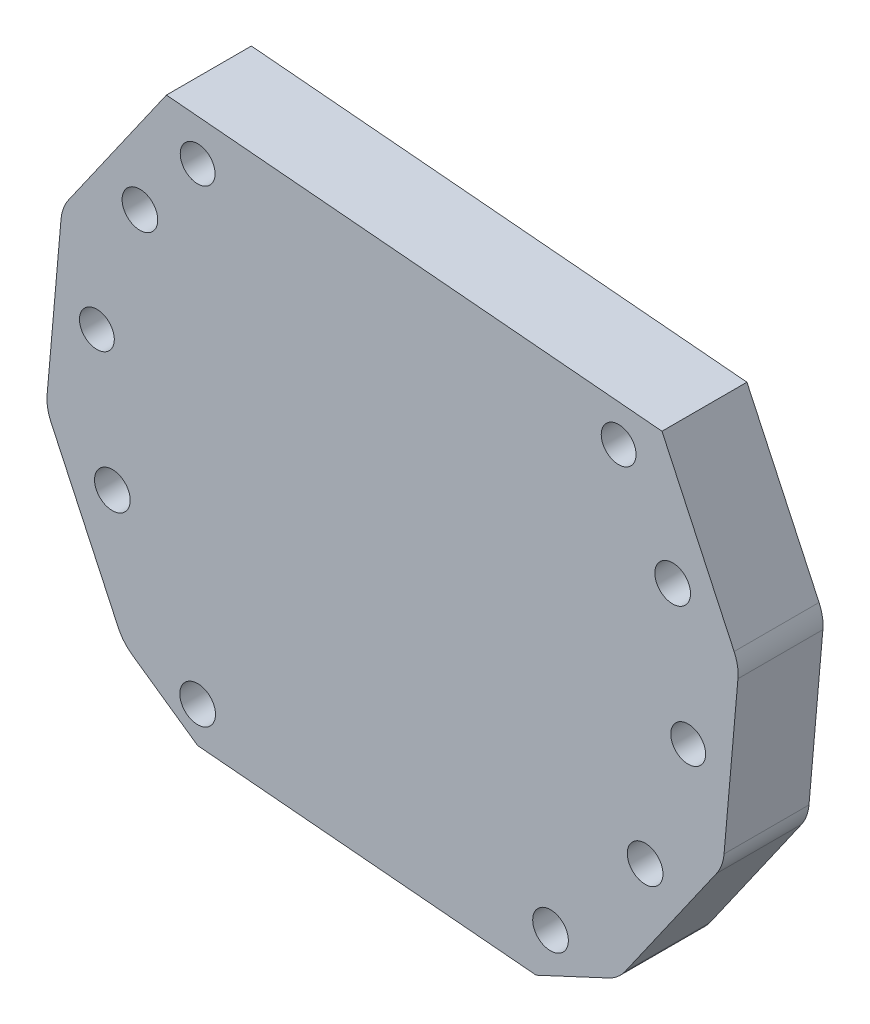
ISO-10303-21;
HEADER;
FILE_DESCRIPTION(('STEP AP214'),'2;1');
FILE_NAME('part.step','',(''),(''),'','','');
FILE_SCHEMA(('AUTOMOTIVE_DESIGN { 1 0 10303 214 1 1 1 1 }'));
ENDSEC;
DATA;
#1=APPLICATION_CONTEXT('core data for automotive mechanical design processes');
#2=APPLICATION_PROTOCOL_DEFINITION('international standard','automotive_design',2000,#1);
#3=PRODUCT_CONTEXT('',#1,'mechanical');
#4=PRODUCT('Part','Part','',(#3));
#5=PRODUCT_RELATED_PRODUCT_CATEGORY('part','',(#4));
#6=PRODUCT_DEFINITION_FORMATION('','',#4);
#7=PRODUCT_DEFINITION_CONTEXT('part definition',#1,'design');
#8=PRODUCT_DEFINITION('design','',#6,#7);
#9=PRODUCT_DEFINITION_SHAPE('','',#8);
#10=(LENGTH_UNIT() NAMED_UNIT(*) SI_UNIT(.MILLI.,.METRE.));
#11=(NAMED_UNIT(*) PLANE_ANGLE_UNIT() SI_UNIT($,.RADIAN.));
#12=(NAMED_UNIT(*) SI_UNIT($,.STERADIAN.) SOLID_ANGLE_UNIT());
#13=UNCERTAINTY_MEASURE_WITH_UNIT(LENGTH_MEASURE(1.E-05),#10,'distance_accuracy_value','');
#14=(GEOMETRIC_REPRESENTATION_CONTEXT(3) GLOBAL_UNCERTAINTY_ASSIGNED_CONTEXT((#13)) GLOBAL_UNIT_ASSIGNED_CONTEXT((#10,
#11,#12)) REPRESENTATION_CONTEXT('',''));
#15=CARTESIAN_POINT('',(0.,0.,0.));
#16=DIRECTION('',(0.,0.,1.));
#17=DIRECTION('',(1.,0.,0.));
#18=AXIS2_PLACEMENT_3D('',#15,#16,#17);
#19=CARTESIAN_POINT('',(-26.6185080548484,31.7227026038633,10.));
#20=DIRECTION('',(-0.087155742747654,-0.996194698091746,0.));
#21=DIRECTION('',(0.996194698091746,-0.087155742747654,0.));
#22=AXIS2_PLACEMENT_3D('',#19,#20,#21);
#23=PLANE('',#22);
#24=DIRECTION('',(-0.996194698091746,0.087155742747654,0.));
#25=VECTOR('',#24,1.);
#26=CARTESIAN_POINT('',(-26.6185080548484,31.7227026038633,0.));
#27=LINE('',#26,#25);
#28=CARTESIAN_POINT('',(31.7227026038633,26.6185080548484,0.));
#29=VERTEX_POINT('',#28);
#30=CARTESIAN_POINT('',(-26.6185080548484,31.7227026038633,0.));
#31=VERTEX_POINT('',#30);
#32=EDGE_CURVE('E172',#29,#31,#27,.T.);
#33=ORIENTED_EDGE('',*,*,#32,.T.);
#34=DIRECTION('',(0.,0.,-1.));
#35=VECTOR('',#34,1.);
#36=CARTESIAN_POINT('',(-26.6185080548484,31.7227026038633,10.));
#37=LINE('',#36,#35);
#38=CARTESIAN_POINT('',(-26.6185080548484,31.7227026038633,10.));
#39=VERTEX_POINT('',#38);
#40=EDGE_CURVE('E154',#39,#31,#37,.T.);
#41=ORIENTED_EDGE('',*,*,#40,.F.);
#42=DIRECTION('',(-0.996194698091746,0.087155742747654,0.));
#43=VECTOR('',#42,1.);
#44=CARTESIAN_POINT('',(-26.6185080548484,31.7227026038633,10.));
#45=LINE('',#44,#43);
#46=CARTESIAN_POINT('',(31.7227026038633,26.6185080548484,10.));
#47=VERTEX_POINT('',#46);
#48=EDGE_CURVE('E160',#47,#39,#45,.T.);
#49=ORIENTED_EDGE('',*,*,#48,.F.);
#50=DIRECTION('',(0.,0.,-1.));
#51=VECTOR('',#50,1.);
#52=CARTESIAN_POINT('',(31.7227026038633,26.6185080548484,10.));
#53=LINE('',#52,#51);
#54=EDGE_CURVE('E253',#47,#29,#53,.T.);
#55=ORIENTED_EDGE('',*,*,#54,.T.);
#56=EDGE_LOOP('',(#33,#41,#49,#55));
#57=FACE_BOUND('',#56,.T.);
#58=ADVANCED_FACE('F35',(#57),#23,.F.);
#59=CARTESIAN_POINT('',(-26.6185080548484,31.7227026038633,10.));
#60=DIRECTION('',(0.819152044288994,-0.573576436351043,0.));
#61=DIRECTION('',(0.573576436351043,0.819152044288994,0.));
#62=AXIS2_PLACEMENT_3D('',#59,#60,#61);
#63=PLANE('',#62);
#64=DIRECTION('',(-0.573576436351043,-0.819152044288994,0.));
#65=VECTOR('',#64,1.);
#66=CARTESIAN_POINT('',(-26.6185080548484,31.7227026038633,0.));
#67=LINE('',#66,#65);
#68=CARTESIAN_POINT('',(-38.1452087736822,15.2608679479478,0.));
#69=VERTEX_POINT('',#68);
#70=EDGE_CURVE('E274',#31,#69,#67,.T.);
#71=ORIENTED_EDGE('',*,*,#70,.T.);
#72=DIRECTION('',(0.,0.,-1.));
#73=VECTOR('',#72,1.);
#74=CARTESIAN_POINT('',(-38.1452087736822,15.2608679479478,10.));
#75=LINE('',#74,#73);
#76=CARTESIAN_POINT('',(-38.1452087736822,15.2608679479478,10.));
#77=VERTEX_POINT('',#76);
#78=EDGE_CURVE('E157',#69,#77,#75,.F.);
#79=ORIENTED_EDGE('',*,*,#78,.T.);
#80=DIRECTION('',(-0.573576436351043,-0.819152044288994,0.));
#81=VECTOR('',#80,1.);
#82=CARTESIAN_POINT('',(-26.6185080548484,31.7227026038633,10.));
#83=LINE('',#82,#81);
#84=EDGE_CURVE('E149',#39,#77,#83,.T.);
#85=ORIENTED_EDGE('',*,*,#84,.F.);
#86=ORIENTED_EDGE('',*,*,#40,.T.);
#87=EDGE_LOOP('',(#71,#79,#85,#86));
#88=FACE_BOUND('',#87,.T.);
#89=ADVANCED_FACE('F152',(#88),#63,.F.);
#90=CARTESIAN_POINT('',(-38.9136554882711,14.1634123042201,10.));
#91=DIRECTION('',(0.996194698091746,-0.0871557427476537,0.));
#92=DIRECTION('',(0.0871557427476537,0.996194698091746,0.));
#93=AXIS2_PLACEMENT_3D('',#90,#91,#92);
#94=PLANE('',#93);
#95=DIRECTION('',(-0.0871557427476537,-0.996194698091746,0.));
#96=VECTOR('',#95,1.);
#97=CARTESIAN_POINT('',(-38.9136554882711,14.1634123042201,0.));
#98=LINE('',#97,#96);
#99=CARTESIAN_POINT('',(-39.0304220426959,12.8287644799309,0.));
#100=VERTEX_POINT('',#99);
#101=CARTESIAN_POINT('',(-40.6651538046437,-5.85630506011857,0.));
#102=VERTEX_POINT('',#101);
#103=EDGE_CURVE('E271',#100,#102,#98,.T.);
#104=ORIENTED_EDGE('',*,*,#103,.T.);
#105=DIRECTION('',(0.,0.,-1.));
#106=VECTOR('',#105,1.);
#107=CARTESIAN_POINT('',(-40.6651538046437,-5.85630506011857,10.));
#108=LINE('',#107,#106);
#109=CARTESIAN_POINT('',(-40.6651538046437,-5.85630506011857,10.));
#110=VERTEX_POINT('',#109);
#111=EDGE_CURVE('E214',#102,#110,#108,.F.);
#112=ORIENTED_EDGE('',*,*,#111,.T.);
#113=DIRECTION('',(-0.0871557427476537,-0.996194698091746,0.));
#114=VECTOR('',#113,1.);
#115=CARTESIAN_POINT('',(-38.9136554882711,14.1634123042201,10.));
#116=LINE('',#115,#114);
#117=CARTESIAN_POINT('',(-39.0304220426959,12.8287644799309,10.));
#118=VERTEX_POINT('',#117);
#119=EDGE_CURVE('E159',#118,#110,#116,.T.);
#120=ORIENTED_EDGE('',*,*,#119,.F.);
#121=DIRECTION('',(0.,0.,-1.));
#122=VECTOR('',#121,1.);
#123=CARTESIAN_POINT('',(-39.0304220426959,12.8287644799309,10.));
#124=LINE('',#123,#122);
#125=EDGE_CURVE('E211',#118,#100,#124,.T.);
#126=ORIENTED_EDGE('',*,*,#125,.T.);
#127=EDGE_LOOP('',(#104,#112,#120,#126));
#128=FACE_BOUND('',#127,.T.);
#129=ADVANCED_FACE('F382',(#128),#94,.F.);
#130=CARTESIAN_POINT('',(-40.7819203590686,-7.19095288440781,10.));
#131=DIRECTION('',(0.906307787036648,0.422618261740704,0.));
#132=DIRECTION('',(-0.422618261740704,0.906307787036648,0.));
#133=AXIS2_PLACEMENT_3D('',#130,#131,#132);
#134=PLANE('',#133);
#135=DIRECTION('',(0.422618261740704,-0.906307787036648,0.));
#136=VECTOR('',#135,1.);
#137=CARTESIAN_POINT('',(-40.7819203590686,-7.19095288440781,0.));
#138=LINE('',#137,#136);
#139=CARTESIAN_POINT('',(-40.2157192493682,-8.40517508256035,0.));
#140=VERTEX_POINT('',#139);
#141=CARTESIAN_POINT('',(-32.2889037135636,-25.4042858566959,0.));
#142=VERTEX_POINT('',#141);
#143=EDGE_CURVE('E266',#140,#142,#138,.T.);
#144=ORIENTED_EDGE('',*,*,#143,.T.);
#145=DIRECTION('',(0.,0.,-1.));
#146=VECTOR('',#145,1.);
#147=CARTESIAN_POINT('',(-32.2889037135636,-25.4042858566959,10.));
#148=LINE('',#147,#146);
#149=CARTESIAN_POINT('',(-32.2889037135636,-25.4042858566959,10.));
#150=VERTEX_POINT('',#149);
#151=EDGE_CURVE('E198',#142,#150,#148,.F.);
#152=ORIENTED_EDGE('',*,*,#151,.T.);
#153=DIRECTION('',(0.422618261740704,-0.906307787036648,0.));
#154=VECTOR('',#153,1.);
#155=CARTESIAN_POINT('',(-40.7819203590686,-7.19095288440781,10.));
#156=LINE('',#155,#154);
#157=CARTESIAN_POINT('',(-40.2157192493682,-8.40517508256035,10.));
#158=VERTEX_POINT('',#157);
#159=EDGE_CURVE('E287',#158,#150,#156,.T.);
#160=ORIENTED_EDGE('',*,*,#159,.F.);
#161=DIRECTION('',(0.,0.,-1.));
#162=VECTOR('',#161,1.);
#163=CARTESIAN_POINT('',(-40.2157192493682,-8.40517508256035,10.));
#164=LINE('',#163,#162);
#165=EDGE_CURVE('E195',#158,#140,#164,.T.);
#166=ORIENTED_EDGE('',*,*,#165,.T.);
#167=EDGE_LOOP('',(#144,#152,#160,#166));
#168=FACE_BOUND('',#167,.T.);
#169=ADVANCED_FACE('F419',(#168),#134,.F.);
#170=CARTESIAN_POINT('',(-31.7227026038632,-26.6185080548485,10.));
#171=DIRECTION('',(0.573576436351043,0.819152044288994,0.));
#172=DIRECTION('',(-0.819152044288994,0.573576436351043,0.));
#173=AXIS2_PLACEMENT_3D('',#170,#171,#172);
#174=PLANE('',#173);
#175=DIRECTION('',(0.819152044288994,-0.573576436351043,0.));
#176=VECTOR('',#175,1.);
#177=CARTESIAN_POINT('',(-31.7227026038632,-26.6185080548485,10.));
#178=LINE('',#177,#176);
#179=CARTESIAN_POINT('',(-30.6252469601355,-27.3869547694374,10.));
#180=VERTEX_POINT('',#179);
#181=CARTESIAN_POINT('',(-22.9430574540417,-32.7660817715598,10.));
#182=VERTEX_POINT('',#181);
#183=EDGE_CURVE('E285',#180,#182,#178,.T.);
#184=ORIENTED_EDGE('',*,*,#183,.F.);
#185=DIRECTION('',(0.,0.,-1.));
#186=VECTOR('',#185,1.);
#187=CARTESIAN_POINT('',(-30.6252469601355,-27.3869547694374,10.));
#188=LINE('',#187,#186);
#189=CARTESIAN_POINT('',(-30.6252469601355,-27.3869547694374,0.));
#190=VERTEX_POINT('',#189);
#191=EDGE_CURVE('E173',#180,#190,#188,.T.);
#192=ORIENTED_EDGE('',*,*,#191,.T.);
#193=DIRECTION('',(0.819152044288994,-0.573576436351043,0.));
#194=VECTOR('',#193,1.);
#195=CARTESIAN_POINT('',(-31.7227026038632,-26.6185080548485,0.));
#196=LINE('',#195,#194);
#197=CARTESIAN_POINT('',(-22.9430574540417,-32.7660817715598,0.));
#198=VERTEX_POINT('',#197);
#199=EDGE_CURVE('E265',#190,#198,#196,.T.);
#200=ORIENTED_EDGE('',*,*,#199,.T.);
#201=DIRECTION('',(0.,0.,-1.));
#202=VECTOR('',#201,1.);
#203=CARTESIAN_POINT('',(-22.9430574540417,-32.7660817715598,10.));
#204=LINE('',#203,#202);
#205=EDGE_CURVE('E174',#182,#198,#204,.T.);
#206=ORIENTED_EDGE('',*,*,#205,.F.);
#207=EDGE_LOOP('',(#184,#192,#200,#206));
#208=FACE_BOUND('',#207,.T.);
#209=ADVANCED_FACE('F413',(#208),#174,.F.);
#210=CARTESIAN_POINT('',(16.9047304696281,-36.2523114814659,10.));
#211=DIRECTION('',(0.0871557427476537,0.996194698091746,0.));
#212=DIRECTION('',(-0.996194698091746,0.0871557427476537,0.));
#213=AXIS2_PLACEMENT_3D('',#210,#211,#212);
#214=PLANE('',#213);
#215=DIRECTION('',(0.996194698091746,-0.0871557427476537,0.));
#216=VECTOR('',#215,1.);
#217=CARTESIAN_POINT('',(16.9047304696281,-36.2523114814659,0.));
#218=LINE('',#217,#216);
#219=CARTESIAN_POINT('',(16.9047304696281,-36.2523114814659,0.));
#220=VERTEX_POINT('',#219);
#221=EDGE_CURVE('E248',#198,#220,#218,.T.);
#222=ORIENTED_EDGE('',*,*,#221,.T.);
#223=DIRECTION('',(0.,0.,-1.));
#224=VECTOR('',#223,1.);
#225=CARTESIAN_POINT('',(16.9047304696281,-36.2523114814659,10.));
#226=LINE('',#225,#224);
#227=CARTESIAN_POINT('',(16.9047304696281,-36.2523114814659,10.));
#228=VERTEX_POINT('',#227);
#229=EDGE_CURVE('E180',#228,#220,#226,.T.);
#230=ORIENTED_EDGE('',*,*,#229,.F.);
#231=DIRECTION('',(0.996194698091746,-0.0871557427476537,0.));
#232=VECTOR('',#231,1.);
#233=CARTESIAN_POINT('',(16.9047304696281,-36.2523114814659,10.));
#234=LINE('',#233,#232);
#235=EDGE_CURVE('E283',#182,#228,#234,.T.);
#236=ORIENTED_EDGE('',*,*,#235,.F.);
#237=ORIENTED_EDGE('',*,*,#205,.T.);
#238=EDGE_LOOP('',(#222,#230,#236,#237));
#239=FACE_BOUND('',#238,.T.);
#240=ADVANCED_FACE('F411',(#239),#214,.F.);
#241=CARTESIAN_POINT('',(16.9047304696281,-36.2523114814659,10.));
#242=DIRECTION('',(-0.422618261740703,0.906307787036648,0.));
#243=DIRECTION('',(-0.906307787036648,-0.422618261740703,0.));
#244=AXIS2_PLACEMENT_3D('',#241,#242,#243);
#245=PLANE('',#244);
#246=DIRECTION('',(0.906307787036648,0.422618261740703,0.));
#247=VECTOR('',#246,1.);
#248=CARTESIAN_POINT('',(16.9047304696281,-36.2523114814659,0.));
#249=LINE('',#248,#247);
#250=CARTESIAN_POINT('',(25.4042858566959,-32.2889037135636,0.));
#251=VERTEX_POINT('',#250);
#252=EDGE_CURVE('E245',#220,#251,#249,.T.);
#253=ORIENTED_EDGE('',*,*,#252,.T.);
#254=DIRECTION('',(0.,0.,-1.));
#255=VECTOR('',#254,1.);
#256=CARTESIAN_POINT('',(25.4042858566959,-32.2889037135636,10.));
#257=LINE('',#256,#255);
#258=CARTESIAN_POINT('',(25.4042858566959,-32.2889037135636,10.));
#259=VERTEX_POINT('',#258);
#260=EDGE_CURVE('E11',#251,#259,#257,.F.);
#261=ORIENTED_EDGE('',*,*,#260,.T.);
#262=DIRECTION('',(0.906307787036648,0.422618261740703,0.));
#263=VECTOR('',#262,1.);
#264=CARTESIAN_POINT('',(16.9047304696281,-36.2523114814659,10.));
#265=LINE('',#264,#263);
#266=EDGE_CURVE('E261',#228,#259,#265,.T.);
#267=ORIENTED_EDGE('',*,*,#266,.F.);
#268=ORIENTED_EDGE('',*,*,#229,.T.);
#269=EDGE_LOOP('',(#253,#261,#267,#268));
#270=FACE_BOUND('',#269,.T.);
#271=ADVANCED_FACE('F258',(#270),#245,.F.);
#272=CARTESIAN_POINT('',(26.6185080548484,-31.7227026038633,10.));
#273=DIRECTION('',(-0.819152044288994,0.573576436351043,0.));
#274=DIRECTION('',(-0.573576436351043,-0.819152044288994,0.));
#275=AXIS2_PLACEMENT_3D('',#272,#273,#274);
#276=PLANE('',#275);
#277=DIRECTION('',(0.573576436351043,0.819152044288994,0.));
#278=VECTOR('',#277,1.);
#279=CARTESIAN_POINT('',(26.6185080548484,-31.7227026038633,10.));
#280=LINE('',#279,#278);
#281=CARTESIAN_POINT('',(27.3869547694374,-30.6252469601356,10.));
#282=VERTEX_POINT('',#281);
#283=CARTESIAN_POINT('',(38.1452087736822,-15.2608679479478,10.));
#284=VERTEX_POINT('',#283);
#285=EDGE_CURVE('E235',#282,#284,#280,.T.);
#286=ORIENTED_EDGE('',*,*,#285,.F.);
#287=DIRECTION('',(0.,0.,-1.));
#288=VECTOR('',#287,1.);
#289=CARTESIAN_POINT('',(27.3869547694374,-30.6252469601356,10.));
#290=LINE('',#289,#288);
#291=CARTESIAN_POINT('',(27.3869547694374,-30.6252469601356,0.));
#292=VERTEX_POINT('',#291);
#293=EDGE_CURVE('E43',#282,#292,#290,.T.);
#294=ORIENTED_EDGE('',*,*,#293,.T.);
#295=DIRECTION('',(0.573576436351043,0.819152044288994,0.));
#296=VECTOR('',#295,1.);
#297=CARTESIAN_POINT('',(26.6185080548484,-31.7227026038633,0.));
#298=LINE('',#297,#296);
#299=CARTESIAN_POINT('',(38.1452087736822,-15.2608679479478,0.));
#300=VERTEX_POINT('',#299);
#301=EDGE_CURVE('E232',#292,#300,#298,.T.);
#302=ORIENTED_EDGE('',*,*,#301,.T.);
#303=DIRECTION('',(0.,0.,-1.));
#304=VECTOR('',#303,1.);
#305=CARTESIAN_POINT('',(38.1452087736822,-15.2608679479478,10.));
#306=LINE('',#305,#304);
#307=EDGE_CURVE('E224',#300,#284,#306,.F.);
#308=ORIENTED_EDGE('',*,*,#307,.T.);
#309=EDGE_LOOP('',(#286,#294,#302,#308));
#310=FACE_BOUND('',#309,.T.);
#311=ADVANCED_FACE('F231',(#310),#276,.F.);
#312=CARTESIAN_POINT('',(38.9136554882711,-14.1634123042201,10.));
#313=DIRECTION('',(-0.996194698091746,0.0871557427476546,0.));
#314=DIRECTION('',(-0.0871557427476546,-0.996194698091746,0.));
#315=AXIS2_PLACEMENT_3D('',#312,#313,#314);
#316=PLANE('',#315);
#317=DIRECTION('',(0.0871557427476546,0.996194698091746,0.));
#318=VECTOR('',#317,1.);
#319=CARTESIAN_POINT('',(38.9136554882711,-14.1634123042201,0.));
#320=LINE('',#319,#318);
#321=CARTESIAN_POINT('',(39.0304220426959,-12.8287644799309,0.));
#322=VERTEX_POINT('',#321);
#323=CARTESIAN_POINT('',(40.6651538046438,5.85630506011856,0.));
#324=VERTEX_POINT('',#323);
#325=EDGE_CURVE('E244',#322,#324,#320,.T.);
#326=ORIENTED_EDGE('',*,*,#325,.T.);
#327=DIRECTION('',(0.,0.,-1.));
#328=VECTOR('',#327,1.);
#329=CARTESIAN_POINT('',(40.6651538046438,5.85630506011856,10.));
#330=LINE('',#329,#328);
#331=CARTESIAN_POINT('',(40.6651538046438,5.85630506011856,10.));
#332=VERTEX_POINT('',#331);
#333=EDGE_CURVE('E58',#324,#332,#330,.F.);
#334=ORIENTED_EDGE('',*,*,#333,.T.);
#335=DIRECTION('',(0.0871557427476546,0.996194698091746,0.));
#336=VECTOR('',#335,1.);
#337=CARTESIAN_POINT('',(38.9136554882711,-14.1634123042201,10.));
#338=LINE('',#337,#336);
#339=CARTESIAN_POINT('',(39.0304220426959,-12.8287644799309,10.));
#340=VERTEX_POINT('',#339);
#341=EDGE_CURVE('E279',#340,#332,#338,.T.);
#342=ORIENTED_EDGE('',*,*,#341,.F.);
#343=DIRECTION('',(0.,0.,-1.));
#344=VECTOR('',#343,1.);
#345=CARTESIAN_POINT('',(39.0304220426959,-12.8287644799309,10.));
#346=LINE('',#345,#344);
#347=EDGE_CURVE('E220',#340,#322,#346,.T.);
#348=ORIENTED_EDGE('',*,*,#347,.T.);
#349=EDGE_LOOP('',(#326,#334,#342,#348));
#350=FACE_BOUND('',#349,.T.);
#351=ADVANCED_FACE('F433',(#350),#316,.F.);
#352=CARTESIAN_POINT('',(40.7819203590686,7.19095288440781,10.));
#353=DIRECTION('',(-0.906307787036648,-0.422618261740703,0.));
#354=DIRECTION('',(0.422618261740703,-0.906307787036648,0.));
#355=AXIS2_PLACEMENT_3D('',#352,#353,#354);
#356=PLANE('',#355);
#357=DIRECTION('',(-0.422618261740703,0.906307787036648,0.));
#358=VECTOR('',#357,1.);
#359=CARTESIAN_POINT('',(40.7819203590686,7.19095288440781,10.));
#360=LINE('',#359,#358);
#361=CARTESIAN_POINT('',(40.2157192493683,8.40517508256034,10.));
#362=VERTEX_POINT('',#361);
#363=EDGE_CURVE('E165',#362,#47,#360,.T.);
#364=ORIENTED_EDGE('',*,*,#363,.F.);
#365=DIRECTION('',(0.,0.,-1.));
#366=VECTOR('',#365,1.);
#367=CARTESIAN_POINT('',(40.2157192493683,8.40517508256034,10.));
#368=LINE('',#367,#366);
#369=CARTESIAN_POINT('',(40.2157192493683,8.40517508256034,0.));
#370=VERTEX_POINT('',#369);
#371=EDGE_CURVE('E217',#362,#370,#368,.T.);
#372=ORIENTED_EDGE('',*,*,#371,.T.);
#373=DIRECTION('',(-0.422618261740703,0.906307787036648,0.));
#374=VECTOR('',#373,1.);
#375=CARTESIAN_POINT('',(40.7819203590686,7.19095288440781,0.));
#376=LINE('',#375,#374);
#377=EDGE_CURVE('E169',#370,#29,#376,.T.);
#378=ORIENTED_EDGE('',*,*,#377,.T.);
#379=ORIENTED_EDGE('',*,*,#54,.F.);
#380=EDGE_LOOP('',(#364,#372,#378,#379));
#381=FACE_BOUND('',#380,.T.);
#382=ADVANCED_FACE('F430',(#381),#356,.F.);
#383=CARTESIAN_POINT('',(0.,0.,10.));
#384=DIRECTION('',(0.,0.,1.));
#385=DIRECTION('',(1.,0.,0.));
#386=AXIS2_PLACEMENT_3D('',#383,#384,#385);
#387=PLANE('',#386);
#388=CARTESIAN_POINT('',(34.8066543870985,-3.73808346977133,10.));
#389=DIRECTION('',(0.,0.,-1.));
#390=DIRECTION('',(-1.,0.,0.));
#391=AXIS2_PLACEMENT_3D('',#388,#389,#390);
#392=CIRCLE('',#391,2.04999999999999);
#393=CARTESIAN_POINT('',(32.7566543870985,-3.73808346977133,10.));
#394=VERTEX_POINT('',#393);
#395=EDGE_CURVE('E324',#394,#394,#392,.T.);
#396=ORIENTED_EDGE('',*,*,#395,.T.);
#397=EDGE_LOOP('',(#396));
#398=FACE_BOUND('',#397,.T.);
#399=CARTESIAN_POINT('',(29.737818365617,-18.4699381835315,10.));
#400=DIRECTION('',(0.,0.,-1.));
#401=DIRECTION('',(-1.,0.,0.));
#402=AXIS2_PLACEMENT_3D('',#399,#400,#401);
#403=CIRCLE('',#402,2.10000000000001);
#404=CARTESIAN_POINT('',(27.637818365617,-18.4699381835315,10.));
#405=VERTEX_POINT('',#404);
#406=EDGE_CURVE('E331',#405,#405,#403,.T.);
#407=ORIENTED_EDGE('',*,*,#406,.T.);
#408=EDGE_LOOP('',(#407));
#409=FACE_BOUND('',#408,.T.);
#410=CARTESIAN_POINT('',(18.6012536594375,-30.8220325763131,10.));
#411=DIRECTION('',(0.,0.,-1.));
#412=DIRECTION('',(-1.,0.,0.));
#413=AXIS2_PLACEMENT_3D('',#410,#411,#412);
#414=CIRCLE('',#413,2.1);
#415=CARTESIAN_POINT('',(16.5012536594375,-30.8220325763131,10.));
#416=VERTEX_POINT('',#415);
#417=EDGE_CURVE('E337',#416,#416,#414,.T.);
#418=ORIENTED_EDGE('',*,*,#417,.T.);
#419=EDGE_LOOP('',(#418));
#420=FACE_BOUND('',#419,.T.);
#421=CARTESIAN_POINT('',(-22.9430574540417,-28.5378329384699,10.));
#422=DIRECTION('',(0.,0.,-1.));
#423=DIRECTION('',(-1.,0.,0.));
#424=AXIS2_PLACEMENT_3D('',#421,#422,#423);
#425=CIRCLE('',#424,2.1);
#426=CARTESIAN_POINT('',(-25.0430574540417,-28.5378329384699,10.));
#427=VERTEX_POINT('',#426);
#428=EDGE_CURVE('E301',#427,#427,#425,.T.);
#429=ORIENTED_EDGE('',*,*,#428,.T.);
#430=EDGE_LOOP('',(#429));
#431=FACE_BOUND('',#430,.T.);
#432=CARTESIAN_POINT('',(-32.9816056316129,-11.734144519762,10.));
#433=DIRECTION('',(0.,0.,-1.));
#434=DIRECTION('',(-1.,0.,0.));
#435=AXIS2_PLACEMENT_3D('',#432,#433,#434);
#436=CIRCLE('',#435,2.1);
#437=CARTESIAN_POINT('',(-35.0816056316129,-11.734144519762,10.));
#438=VERTEX_POINT('',#437);
#439=EDGE_CURVE('E300',#438,#438,#436,.T.);
#440=ORIENTED_EDGE('',*,*,#439,.T.);
#441=EDGE_LOOP('',(#440));
#442=FACE_BOUND('',#441,.T.);
#443=CARTESIAN_POINT('',(-34.8066543870985,3.73808346977158,10.));
#444=DIRECTION('',(0.,0.,-1.));
#445=DIRECTION('',(-1.,0.,0.));
#446=AXIS2_PLACEMENT_3D('',#443,#444,#445);
#447=CIRCLE('',#446,2.04999999999999);
#448=CARTESIAN_POINT('',(-36.8566543870985,3.73808346977158,10.));
#449=VERTEX_POINT('',#448);
#450=EDGE_CURVE('E307',#449,#449,#447,.T.);
#451=ORIENTED_EDGE('',*,*,#450,.T.);
#452=EDGE_LOOP('',(#451));
#453=FACE_BOUND('',#452,.T.);
#454=CARTESIAN_POINT('',(-29.7378183656169,18.4699381835317,10.));
#455=DIRECTION('',(0.,0.,-1.));
#456=DIRECTION('',(-1.,0.,0.));
#457=AXIS2_PLACEMENT_3D('',#454,#455,#456);
#458=CIRCLE('',#457,2.1);
#459=CARTESIAN_POINT('',(-31.8378183656169,18.4699381835317,10.));
#460=VERTEX_POINT('',#459);
#461=EDGE_CURVE('E313',#460,#460,#458,.T.);
#462=ORIENTED_EDGE('',*,*,#461,.T.);
#463=EDGE_LOOP('',(#462));
#464=FACE_BOUND('',#463,.T.);
#465=CARTESIAN_POINT('',(-22.9430574540417,26.5542753286264,10.));
#466=DIRECTION('',(0.,0.,-1.));
#467=DIRECTION('',(-1.,0.,0.));
#468=AXIS2_PLACEMENT_3D('',#465,#466,#467);
#469=CIRCLE('',#468,2.05);
#470=CARTESIAN_POINT('',(-24.9930574540417,26.5542753286264,10.));
#471=VERTEX_POINT('',#470);
#472=EDGE_CURVE('E294',#471,#471,#469,.T.);
#473=ORIENTED_EDGE('',*,*,#472,.T.);
#474=EDGE_LOOP('',(#473));
#475=FACE_BOUND('',#474,.T.);
#476=CARTESIAN_POINT('',(32.981605631613,11.7341445197618,10.));
#477=DIRECTION('',(0.,0.,-1.));
#478=DIRECTION('',(-1.,0.,0.));
#479=AXIS2_PLACEMENT_3D('',#476,#477,#478);
#480=CIRCLE('',#479,2.1);
#481=CARTESIAN_POINT('',(30.881605631613,11.7341445197618,10.));
#482=VERTEX_POINT('',#481);
#483=EDGE_CURVE('E325',#482,#482,#480,.T.);
#484=ORIENTED_EDGE('',*,*,#483,.T.);
#485=EDGE_LOOP('',(#484));
#486=FACE_BOUND('',#485,.T.);
#487=CARTESIAN_POINT('',(26.6185080548484,22.7058718934025,10.));
#488=DIRECTION('',(0.,0.,-1.));
#489=DIRECTION('',(-1.,0.,0.));
#490=AXIS2_PLACEMENT_3D('',#487,#488,#489);
#491=CIRCLE('',#490,2.05);
#492=CARTESIAN_POINT('',(24.5685080548484,22.7058718934025,10.));
#493=VERTEX_POINT('',#492);
#494=EDGE_CURVE('E277',#493,#493,#491,.T.);
#495=ORIENTED_EDGE('',*,*,#494,.T.);
#496=EDGE_LOOP('',(#495));
#497=FACE_BOUND('',#496,.T.);
#498=ORIENTED_EDGE('',*,*,#159,.T.);
#499=CARTESIAN_POINT('',(-27.7573647783803,-23.2911945479924,10.));
#500=DIRECTION('',(0.,0.,1.));
#501=DIRECTION('',(1.,0.,0.));
#502=AXIS2_PLACEMENT_3D('',#499,#500,#501);
#503=CIRCLE('',#502,5.);
#504=EDGE_CURVE('E209',#150,#180,#503,.T.);
#505=ORIENTED_EDGE('',*,*,#504,.T.);
#506=ORIENTED_EDGE('',*,*,#183,.T.);
#507=ORIENTED_EDGE('',*,*,#235,.T.);
#508=ORIENTED_EDGE('',*,*,#266,.T.);
#509=CARTESIAN_POINT('',(23.2911945479924,-27.7573647783804,10.));
#510=DIRECTION('',(0.,0.,1.));
#511=DIRECTION('',(1.,0.,0.));
#512=AXIS2_PLACEMENT_3D('',#509,#510,#511);
#513=CIRCLE('',#512,5.);
#514=EDGE_CURVE('E202',#259,#282,#513,.T.);
#515=ORIENTED_EDGE('',*,*,#514,.T.);
#516=ORIENTED_EDGE('',*,*,#285,.T.);
#517=CARTESIAN_POINT('',(34.0494485522372,-12.3929857661926,10.));
#518=DIRECTION('',(0.,0.,1.));
#519=DIRECTION('',(1.,0.,0.));
#520=AXIS2_PLACEMENT_3D('',#517,#518,#519);
#521=CIRCLE('',#520,5.);
#522=EDGE_CURVE('E200',#284,#340,#521,.T.);
#523=ORIENTED_EDGE('',*,*,#522,.T.);
#524=ORIENTED_EDGE('',*,*,#341,.T.);
#525=CARTESIAN_POINT('',(35.684180314185,6.29208377385683,10.));
#526=DIRECTION('',(0.,0.,1.));
#527=DIRECTION('',(1.,0.,0.));
#528=AXIS2_PLACEMENT_3D('',#525,#526,#527);
#529=CIRCLE('',#528,5.);
#530=EDGE_CURVE('E50',#332,#362,#529,.T.);
#531=ORIENTED_EDGE('',*,*,#530,.T.);
#532=ORIENTED_EDGE('',*,*,#363,.T.);
#533=ORIENTED_EDGE('',*,*,#48,.T.);
#534=ORIENTED_EDGE('',*,*,#84,.T.);
#535=CARTESIAN_POINT('',(-34.0494485522372,12.3929857661926,10.));
#536=DIRECTION('',(0.,0.,1.));
#537=DIRECTION('',(1.,0.,0.));
#538=AXIS2_PLACEMENT_3D('',#535,#536,#537);
#539=CIRCLE('',#538,5.);
#540=EDGE_CURVE('E205',#77,#118,#539,.T.);
#541=ORIENTED_EDGE('',*,*,#540,.T.);
#542=ORIENTED_EDGE('',*,*,#119,.T.);
#543=CARTESIAN_POINT('',(-35.684180314185,-6.29208377385683,10.));
#544=DIRECTION('',(0.,0.,1.));
#545=DIRECTION('',(1.,0.,0.));
#546=AXIS2_PLACEMENT_3D('',#543,#544,#545);
#547=CIRCLE('',#546,5.);
#548=EDGE_CURVE('E207',#110,#158,#547,.T.);
#549=ORIENTED_EDGE('',*,*,#548,.T.);
#550=EDGE_LOOP('',(#498,#505,#506,#507,#508,#515,#516,#523,#524,#531,#532,#533,#534,#541,#542,#549));
#551=FACE_BOUND('',#550,.T.);
#552=ADVANCED_FACE('F164',(#398,#409,#420,#431,#442,#453,#464,#475,#486,#497,#551),#387,.T.);
#553=CARTESIAN_POINT('',(0.,0.,0.));
#554=DIRECTION('',(0.,0.,1.));
#555=DIRECTION('',(1.,0.,0.));
#556=AXIS2_PLACEMENT_3D('',#553,#554,#555);
#557=PLANE('',#556);
#558=CARTESIAN_POINT('',(34.8066543870985,-3.73808346977133,0.));
#559=DIRECTION('',(0.,0.,-1.));
#560=DIRECTION('',(-1.,0.,0.));
#561=AXIS2_PLACEMENT_3D('',#558,#559,#560);
#562=CIRCLE('',#561,2.04999999999999);
#563=CARTESIAN_POINT('',(32.7566543870985,-3.73808346977133,0.));
#564=VERTEX_POINT('',#563);
#565=EDGE_CURVE('E321',#564,#564,#562,.T.);
#566=ORIENTED_EDGE('',*,*,#565,.F.);
#567=EDGE_LOOP('',(#566));
#568=FACE_BOUND('',#567,.T.);
#569=CARTESIAN_POINT('',(29.737818365617,-18.4699381835315,0.));
#570=DIRECTION('',(0.,0.,-1.));
#571=DIRECTION('',(-1.,0.,0.));
#572=AXIS2_PLACEMENT_3D('',#569,#570,#571);
#573=CIRCLE('',#572,2.10000000000001);
#574=CARTESIAN_POINT('',(27.637818365617,-18.4699381835315,0.));
#575=VERTEX_POINT('',#574);
#576=EDGE_CURVE('E328',#575,#575,#573,.T.);
#577=ORIENTED_EDGE('',*,*,#576,.F.);
#578=EDGE_LOOP('',(#577));
#579=FACE_BOUND('',#578,.T.);
#580=CARTESIAN_POINT('',(18.6012536594375,-30.8220325763131,0.));
#581=DIRECTION('',(0.,0.,-1.));
#582=DIRECTION('',(-1.,0.,0.));
#583=AXIS2_PLACEMENT_3D('',#580,#581,#582);
#584=CIRCLE('',#583,2.1);
#585=CARTESIAN_POINT('',(16.5012536594375,-30.8220325763131,0.));
#586=VERTEX_POINT('',#585);
#587=EDGE_CURVE('E334',#586,#586,#584,.T.);
#588=ORIENTED_EDGE('',*,*,#587,.F.);
#589=EDGE_LOOP('',(#588));
#590=FACE_BOUND('',#589,.T.);
#591=CARTESIAN_POINT('',(-22.9430574540417,-28.5378329384699,0.));
#592=DIRECTION('',(0.,0.,-1.));
#593=DIRECTION('',(-1.,0.,0.));
#594=AXIS2_PLACEMENT_3D('',#591,#592,#593);
#595=CIRCLE('',#594,2.1);
#596=CARTESIAN_POINT('',(-25.0430574540417,-28.5378329384699,0.));
#597=VERTEX_POINT('',#596);
#598=EDGE_CURVE('E340',#597,#597,#595,.T.);
#599=ORIENTED_EDGE('',*,*,#598,.F.);
#600=EDGE_LOOP('',(#599));
#601=FACE_BOUND('',#600,.T.);
#602=CARTESIAN_POINT('',(-32.9816056316129,-11.734144519762,0.));
#603=DIRECTION('',(0.,0.,-1.));
#604=DIRECTION('',(-1.,0.,0.));
#605=AXIS2_PLACEMENT_3D('',#602,#603,#604);
#606=CIRCLE('',#605,2.1);
#607=CARTESIAN_POINT('',(-35.0816056316129,-11.734144519762,0.));
#608=VERTEX_POINT('',#607);
#609=EDGE_CURVE('E297',#608,#608,#606,.T.);
#610=ORIENTED_EDGE('',*,*,#609,.F.);
#611=EDGE_LOOP('',(#610));
#612=FACE_BOUND('',#611,.T.);
#613=CARTESIAN_POINT('',(-34.8066543870985,3.73808346977158,0.));
#614=DIRECTION('',(0.,0.,-1.));
#615=DIRECTION('',(-1.,0.,0.));
#616=AXIS2_PLACEMENT_3D('',#613,#614,#615);
#617=CIRCLE('',#616,2.04999999999999);
#618=CARTESIAN_POINT('',(-36.8566543870985,3.73808346977158,0.));
#619=VERTEX_POINT('',#618);
#620=EDGE_CURVE('E304',#619,#619,#617,.T.);
#621=ORIENTED_EDGE('',*,*,#620,.F.);
#622=EDGE_LOOP('',(#621));
#623=FACE_BOUND('',#622,.T.);
#624=CARTESIAN_POINT('',(-29.7378183656169,18.4699381835317,0.));
#625=DIRECTION('',(0.,0.,-1.));
#626=DIRECTION('',(-1.,0.,0.));
#627=AXIS2_PLACEMENT_3D('',#624,#625,#626);
#628=CIRCLE('',#627,2.1);
#629=CARTESIAN_POINT('',(-31.8378183656169,18.4699381835317,0.));
#630=VERTEX_POINT('',#629);
#631=EDGE_CURVE('E310',#630,#630,#628,.T.);
#632=ORIENTED_EDGE('',*,*,#631,.F.);
#633=EDGE_LOOP('',(#632));
#634=FACE_BOUND('',#633,.T.);
#635=CARTESIAN_POINT('',(-22.9430574540417,26.5542753286264,0.));
#636=DIRECTION('',(0.,0.,-1.));
#637=DIRECTION('',(-1.,0.,0.));
#638=AXIS2_PLACEMENT_3D('',#635,#636,#637);
#639=CIRCLE('',#638,2.05);
#640=CARTESIAN_POINT('',(-24.9930574540417,26.5542753286264,0.));
#641=VERTEX_POINT('',#640);
#642=EDGE_CURVE('E316',#641,#641,#639,.T.);
#643=ORIENTED_EDGE('',*,*,#642,.F.);
#644=EDGE_LOOP('',(#643));
#645=FACE_BOUND('',#644,.T.);
#646=CARTESIAN_POINT('',(32.981605631613,11.7341445197618,0.));
#647=DIRECTION('',(0.,0.,-1.));
#648=DIRECTION('',(-1.,0.,0.));
#649=AXIS2_PLACEMENT_3D('',#646,#647,#648);
#650=CIRCLE('',#649,2.1);
#651=CARTESIAN_POINT('',(30.881605631613,11.7341445197618,0.));
#652=VERTEX_POINT('',#651);
#653=EDGE_CURVE('E345',#652,#652,#650,.T.);
#654=ORIENTED_EDGE('',*,*,#653,.F.);
#655=EDGE_LOOP('',(#654));
#656=FACE_BOUND('',#655,.T.);
#657=CARTESIAN_POINT('',(26.6185080548484,22.7058718934025,0.));
#658=DIRECTION('',(0.,0.,-1.));
#659=DIRECTION('',(-1.,0.,0.));
#660=AXIS2_PLACEMENT_3D('',#657,#658,#659);
#661=CIRCLE('',#660,2.05);
#662=CARTESIAN_POINT('',(24.5685080548484,22.7058718934025,0.));
#663=VERTEX_POINT('',#662);
#664=EDGE_CURVE('E291',#663,#663,#661,.T.);
#665=ORIENTED_EDGE('',*,*,#664,.F.);
#666=EDGE_LOOP('',(#665));
#667=FACE_BOUND('',#666,.T.);
#668=ORIENTED_EDGE('',*,*,#199,.F.);
#669=CARTESIAN_POINT('',(-27.7573647783803,-23.2911945479924,0.));
#670=DIRECTION('',(0.,0.,1.));
#671=DIRECTION('',(1.,0.,0.));
#672=AXIS2_PLACEMENT_3D('',#669,#670,#671);
#673=CIRCLE('',#672,5.);
#674=EDGE_CURVE('E193',#190,#142,#673,.F.);
#675=ORIENTED_EDGE('',*,*,#674,.T.);
#676=ORIENTED_EDGE('',*,*,#143,.F.);
#677=CARTESIAN_POINT('',(-35.684180314185,-6.29208377385683,0.));
#678=DIRECTION('',(0.,0.,1.));
#679=DIRECTION('',(1.,0.,0.));
#680=AXIS2_PLACEMENT_3D('',#677,#678,#679);
#681=CIRCLE('',#680,5.);
#682=EDGE_CURVE('E191',#140,#102,#681,.F.);
#683=ORIENTED_EDGE('',*,*,#682,.T.);
#684=ORIENTED_EDGE('',*,*,#103,.F.);
#685=CARTESIAN_POINT('',(-34.0494485522372,12.3929857661926,0.));
#686=DIRECTION('',(0.,0.,1.));
#687=DIRECTION('',(1.,0.,0.));
#688=AXIS2_PLACEMENT_3D('',#685,#686,#687);
#689=CIRCLE('',#688,5.);
#690=EDGE_CURVE('E189',#100,#69,#689,.F.);
#691=ORIENTED_EDGE('',*,*,#690,.T.);
#692=ORIENTED_EDGE('',*,*,#70,.F.);
#693=ORIENTED_EDGE('',*,*,#32,.F.);
#694=ORIENTED_EDGE('',*,*,#377,.F.);
#695=CARTESIAN_POINT('',(35.684180314185,6.29208377385683,0.));
#696=DIRECTION('',(0.,0.,1.));
#697=DIRECTION('',(1.,0.,0.));
#698=AXIS2_PLACEMENT_3D('',#695,#696,#697);
#699=CIRCLE('',#698,5.);
#700=EDGE_CURVE('E187',#370,#324,#699,.F.);
#701=ORIENTED_EDGE('',*,*,#700,.T.);
#702=ORIENTED_EDGE('',*,*,#325,.F.);
#703=CARTESIAN_POINT('',(34.0494485522372,-12.3929857661926,0.));
#704=DIRECTION('',(0.,0.,1.));
#705=DIRECTION('',(1.,0.,0.));
#706=AXIS2_PLACEMENT_3D('',#703,#704,#705);
#707=CIRCLE('',#706,5.);
#708=EDGE_CURVE('E177',#322,#300,#707,.F.);
#709=ORIENTED_EDGE('',*,*,#708,.T.);
#710=ORIENTED_EDGE('',*,*,#301,.F.);
#711=CARTESIAN_POINT('',(23.2911945479924,-27.7573647783804,0.));
#712=DIRECTION('',(0.,0.,1.));
#713=DIRECTION('',(1.,0.,0.));
#714=AXIS2_PLACEMENT_3D('',#711,#712,#713);
#715=CIRCLE('',#714,5.);
#716=EDGE_CURVE('E185',#292,#251,#715,.F.);
#717=ORIENTED_EDGE('',*,*,#716,.T.);
#718=ORIENTED_EDGE('',*,*,#252,.F.);
#719=ORIENTED_EDGE('',*,*,#221,.F.);
#720=EDGE_LOOP('',(#668,#675,#676,#683,#684,#691,#692,#693,#694,#701,#702,#709,#710,#717,#718,#719));
#721=FACE_BOUND('',#720,.T.);
#722=ADVANCED_FACE('F240',(#568,#579,#590,#601,#612,#623,#634,#645,#656,#667,#721),#557,.F.);
#723=CARTESIAN_POINT('',(26.6185080548484,22.7058718934025,10.));
#724=DIRECTION('',(0.,0.,-1.));
#725=DIRECTION('',(-1.,0.,0.));
#726=AXIS2_PLACEMENT_3D('',#723,#724,#725);
#727=CYLINDRICAL_SURFACE('',#726,2.05);
#728=ORIENTED_EDGE('',*,*,#494,.F.);
#729=EDGE_LOOP('',(#728));
#730=FACE_BOUND('',#729,.T.);
#731=ORIENTED_EDGE('',*,*,#664,.T.);
#732=EDGE_LOOP('',(#731));
#733=FACE_BOUND('',#732,.T.);
#734=ADVANCED_FACE('F357',(#730,#733),#727,.F.);
#735=CARTESIAN_POINT('',(32.981605631613,11.7341445197618,10.));
#736=DIRECTION('',(0.,0.,-1.));
#737=DIRECTION('',(-1.,0.,0.));
#738=AXIS2_PLACEMENT_3D('',#735,#736,#737);
#739=CYLINDRICAL_SURFACE('',#738,2.1);
#740=ORIENTED_EDGE('',*,*,#483,.F.);
#741=EDGE_LOOP('',(#740));
#742=FACE_BOUND('',#741,.T.);
#743=ORIENTED_EDGE('',*,*,#653,.T.);
#744=EDGE_LOOP('',(#743));
#745=FACE_BOUND('',#744,.T.);
#746=ADVANCED_FACE('F353',(#742,#745),#739,.F.);
#747=CARTESIAN_POINT('',(-22.9430574540417,26.5542753286264,10.));
#748=DIRECTION('',(0.,0.,-1.));
#749=DIRECTION('',(-1.,0.,0.));
#750=AXIS2_PLACEMENT_3D('',#747,#748,#749);
#751=CYLINDRICAL_SURFACE('',#750,2.05);
#752=ORIENTED_EDGE('',*,*,#472,.F.);
#753=EDGE_LOOP('',(#752));
#754=FACE_BOUND('',#753,.T.);
#755=ORIENTED_EDGE('',*,*,#642,.T.);
#756=EDGE_LOOP('',(#755));
#757=FACE_BOUND('',#756,.T.);
#758=ADVANCED_FACE('F356',(#754,#757),#751,.F.);
#759=CARTESIAN_POINT('',(-29.7378183656169,18.4699381835317,10.));
#760=DIRECTION('',(0.,0.,-1.));
#761=DIRECTION('',(-1.,0.,0.));
#762=AXIS2_PLACEMENT_3D('',#759,#760,#761);
#763=CYLINDRICAL_SURFACE('',#762,2.1);
#764=ORIENTED_EDGE('',*,*,#461,.F.);
#765=EDGE_LOOP('',(#764));
#766=FACE_BOUND('',#765,.T.);
#767=ORIENTED_EDGE('',*,*,#631,.T.);
#768=EDGE_LOOP('',(#767));
#769=FACE_BOUND('',#768,.T.);
#770=ADVANCED_FACE('F572',(#766,#769),#763,.F.);
#771=CARTESIAN_POINT('',(-34.8066543870985,3.73808346977158,10.));
#772=DIRECTION('',(0.,0.,-1.));
#773=DIRECTION('',(-1.,0.,0.));
#774=AXIS2_PLACEMENT_3D('',#771,#772,#773);
#775=CYLINDRICAL_SURFACE('',#774,2.04999999999999);
#776=ORIENTED_EDGE('',*,*,#450,.F.);
#777=EDGE_LOOP('',(#776));
#778=FACE_BOUND('',#777,.T.);
#779=ORIENTED_EDGE('',*,*,#620,.T.);
#780=EDGE_LOOP('',(#779));
#781=FACE_BOUND('',#780,.T.);
#782=ADVANCED_FACE('F565',(#778,#781),#775,.F.);
#783=CARTESIAN_POINT('',(-32.9816056316129,-11.734144519762,10.));
#784=DIRECTION('',(0.,0.,-1.));
#785=DIRECTION('',(-1.,0.,0.));
#786=AXIS2_PLACEMENT_3D('',#783,#784,#785);
#787=CYLINDRICAL_SURFACE('',#786,2.1);
#788=ORIENTED_EDGE('',*,*,#439,.F.);
#789=EDGE_LOOP('',(#788));
#790=FACE_BOUND('',#789,.T.);
#791=ORIENTED_EDGE('',*,*,#609,.T.);
#792=EDGE_LOOP('',(#791));
#793=FACE_BOUND('',#792,.T.);
#794=ADVANCED_FACE('F557',(#790,#793),#787,.F.);
#795=CARTESIAN_POINT('',(-22.9430574540417,-28.5378329384699,10.));
#796=DIRECTION('',(0.,0.,-1.));
#797=DIRECTION('',(-1.,0.,0.));
#798=AXIS2_PLACEMENT_3D('',#795,#796,#797);
#799=CYLINDRICAL_SURFACE('',#798,2.1);
#800=ORIENTED_EDGE('',*,*,#428,.F.);
#801=EDGE_LOOP('',(#800));
#802=FACE_BOUND('',#801,.T.);
#803=ORIENTED_EDGE('',*,*,#598,.T.);
#804=EDGE_LOOP('',(#803));
#805=FACE_BOUND('',#804,.T.);
#806=ADVANCED_FACE('F549',(#802,#805),#799,.F.);
#807=CARTESIAN_POINT('',(18.6012536594375,-30.8220325763131,10.));
#808=DIRECTION('',(0.,0.,-1.));
#809=DIRECTION('',(-1.,0.,0.));
#810=AXIS2_PLACEMENT_3D('',#807,#808,#809);
#811=CYLINDRICAL_SURFACE('',#810,2.1);
#812=ORIENTED_EDGE('',*,*,#417,.F.);
#813=EDGE_LOOP('',(#812));
#814=FACE_BOUND('',#813,.T.);
#815=ORIENTED_EDGE('',*,*,#587,.T.);
#816=EDGE_LOOP('',(#815));
#817=FACE_BOUND('',#816,.T.);
#818=ADVANCED_FACE('F541',(#814,#817),#811,.F.);
#819=CARTESIAN_POINT('',(29.737818365617,-18.4699381835315,10.));
#820=DIRECTION('',(0.,0.,-1.));
#821=DIRECTION('',(-1.,0.,0.));
#822=AXIS2_PLACEMENT_3D('',#819,#820,#821);
#823=CYLINDRICAL_SURFACE('',#822,2.10000000000001);
#824=ORIENTED_EDGE('',*,*,#406,.F.);
#825=EDGE_LOOP('',(#824));
#826=FACE_BOUND('',#825,.T.);
#827=ORIENTED_EDGE('',*,*,#576,.T.);
#828=EDGE_LOOP('',(#827));
#829=FACE_BOUND('',#828,.T.);
#830=ADVANCED_FACE('F534',(#826,#829),#823,.F.);
#831=CARTESIAN_POINT('',(34.8066543870985,-3.73808346977133,10.));
#832=DIRECTION('',(0.,0.,-1.));
#833=DIRECTION('',(-1.,0.,0.));
#834=AXIS2_PLACEMENT_3D('',#831,#832,#833);
#835=CYLINDRICAL_SURFACE('',#834,2.04999999999999);
#836=ORIENTED_EDGE('',*,*,#395,.F.);
#837=EDGE_LOOP('',(#836));
#838=FACE_BOUND('',#837,.T.);
#839=ORIENTED_EDGE('',*,*,#565,.T.);
#840=EDGE_LOOP('',(#839));
#841=FACE_BOUND('',#840,.T.);
#842=ADVANCED_FACE('F390',(#838,#841),#835,.F.);
#843=CARTESIAN_POINT('',(-27.7573647783803,-23.2911945479924,10.));
#844=DIRECTION('',(0.,0.,-1.));
#845=DIRECTION('',(-1.,0.,0.));
#846=AXIS2_PLACEMENT_3D('',#843,#844,#845);
#847=CYLINDRICAL_SURFACE('',#846,5.);
#848=ORIENTED_EDGE('',*,*,#504,.F.);
#849=ORIENTED_EDGE('',*,*,#151,.F.);
#850=ORIENTED_EDGE('',*,*,#674,.F.);
#851=ORIENTED_EDGE('',*,*,#191,.F.);
#852=EDGE_LOOP('',(#848,#849,#850,#851));
#853=FACE_BOUND('',#852,.T.);
#854=ADVANCED_FACE('F386',(#853),#847,.T.);
#855=CARTESIAN_POINT('',(-35.684180314185,-6.29208377385683,10.));
#856=DIRECTION('',(0.,0.,-1.));
#857=DIRECTION('',(-1.,0.,0.));
#858=AXIS2_PLACEMENT_3D('',#855,#856,#857);
#859=CYLINDRICAL_SURFACE('',#858,5.);
#860=ORIENTED_EDGE('',*,*,#548,.F.);
#861=ORIENTED_EDGE('',*,*,#111,.F.);
#862=ORIENTED_EDGE('',*,*,#682,.F.);
#863=ORIENTED_EDGE('',*,*,#165,.F.);
#864=EDGE_LOOP('',(#860,#861,#862,#863));
#865=FACE_BOUND('',#864,.T.);
#866=ADVANCED_FACE('F389',(#865),#859,.T.);
#867=CARTESIAN_POINT('',(-34.0494485522372,12.3929857661926,10.));
#868=DIRECTION('',(0.,0.,-1.));
#869=DIRECTION('',(-1.,0.,0.));
#870=AXIS2_PLACEMENT_3D('',#867,#868,#869);
#871=CYLINDRICAL_SURFACE('',#870,5.);
#872=ORIENTED_EDGE('',*,*,#540,.F.);
#873=ORIENTED_EDGE('',*,*,#78,.F.);
#874=ORIENTED_EDGE('',*,*,#690,.F.);
#875=ORIENTED_EDGE('',*,*,#125,.F.);
#876=EDGE_LOOP('',(#872,#873,#874,#875));
#877=FACE_BOUND('',#876,.T.);
#878=ADVANCED_FACE('F394',(#877),#871,.T.);
#879=CARTESIAN_POINT('',(35.684180314185,6.29208377385683,10.));
#880=DIRECTION('',(0.,0.,-1.));
#881=DIRECTION('',(-1.,0.,0.));
#882=AXIS2_PLACEMENT_3D('',#879,#880,#881);
#883=CYLINDRICAL_SURFACE('',#882,5.);
#884=ORIENTED_EDGE('',*,*,#530,.F.);
#885=ORIENTED_EDGE('',*,*,#333,.F.);
#886=ORIENTED_EDGE('',*,*,#700,.F.);
#887=ORIENTED_EDGE('',*,*,#371,.F.);
#888=EDGE_LOOP('',(#884,#885,#886,#887));
#889=FACE_BOUND('',#888,.T.);
#890=ADVANCED_FACE('F398',(#889),#883,.T.);
#891=CARTESIAN_POINT('',(23.2911945479924,-27.7573647783804,10.));
#892=DIRECTION('',(0.,0.,-1.));
#893=DIRECTION('',(-1.,0.,0.));
#894=AXIS2_PLACEMENT_3D('',#891,#892,#893);
#895=CYLINDRICAL_SURFACE('',#894,5.);
#896=ORIENTED_EDGE('',*,*,#514,.F.);
#897=ORIENTED_EDGE('',*,*,#260,.F.);
#898=ORIENTED_EDGE('',*,*,#716,.F.);
#899=ORIENTED_EDGE('',*,*,#293,.F.);
#900=EDGE_LOOP('',(#896,#897,#898,#899));
#901=FACE_BOUND('',#900,.T.);
#902=ADVANCED_FACE('F401',(#901),#895,.T.);
#903=CARTESIAN_POINT('',(34.0494485522372,-12.3929857661926,10.));
#904=DIRECTION('',(0.,0.,-1.));
#905=DIRECTION('',(-1.,0.,0.));
#906=AXIS2_PLACEMENT_3D('',#903,#904,#905);
#907=CYLINDRICAL_SURFACE('',#906,5.);
#908=ORIENTED_EDGE('',*,*,#522,.F.);
#909=ORIENTED_EDGE('',*,*,#307,.F.);
#910=ORIENTED_EDGE('',*,*,#708,.F.);
#911=ORIENTED_EDGE('',*,*,#347,.F.);
#912=EDGE_LOOP('',(#908,#909,#910,#911));
#913=FACE_BOUND('',#912,.T.);
#914=ADVANCED_FACE('F37',(#913),#907,.T.);
#915=CLOSED_SHELL('',(#58,#89,#129,#169,#209,#240,#271,#311,#351,#382,#552,#722,#734,#746,#758,
#770,#782,#794,#806,#818,#830,#842,#854,#866,#878,#890,#902,#914));
#916=MANIFOLD_SOLID_BREP('B2',#915);
#917=ADVANCED_BREP_SHAPE_REPRESENTATION('',(#18,#916),#14);
#918=SHAPE_DEFINITION_REPRESENTATION(#9,#917);
ENDSEC;
END-ISO-10303-21;
